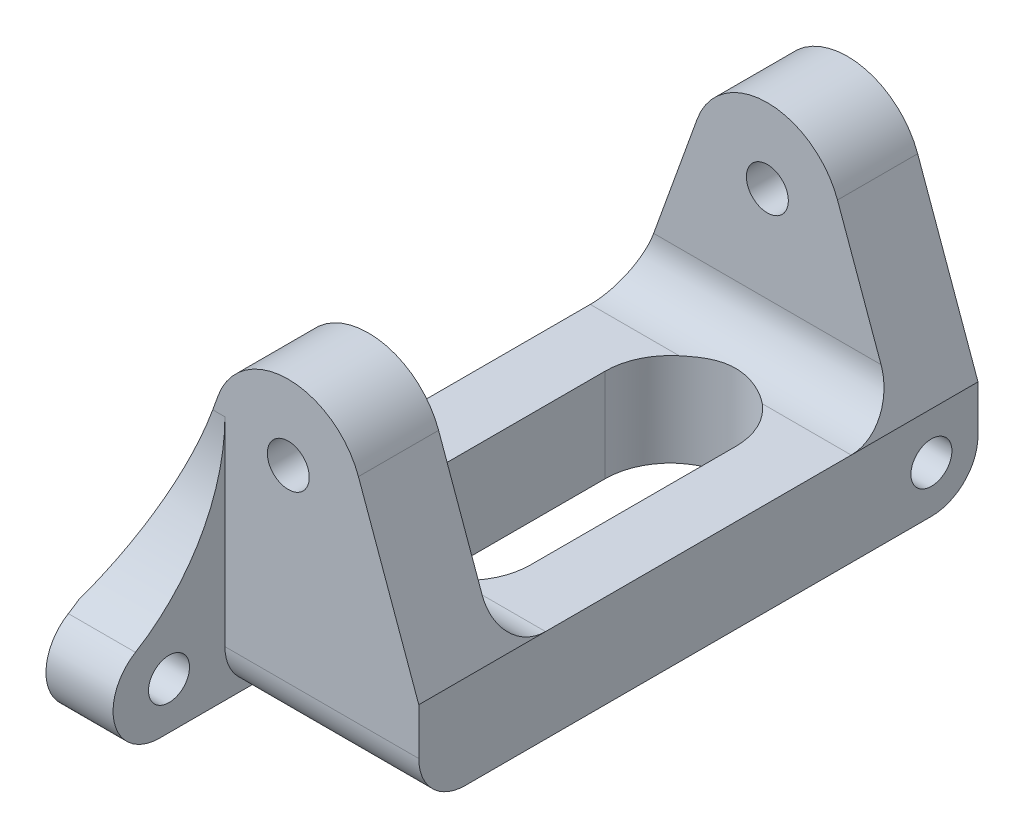
ISO-10303-21;
HEADER;
FILE_DESCRIPTION(('STEP AP214'),'2;1');
FILE_NAME('part.step','',(''),(''),'','','');
FILE_SCHEMA(('AUTOMOTIVE_DESIGN { 1 0 10303 214 1 1 1 1 }'));
ENDSEC;
DATA;
#1=APPLICATION_CONTEXT('core data for automotive mechanical design processes');
#2=APPLICATION_PROTOCOL_DEFINITION('international standard','automotive_design',2000,#1);
#3=PRODUCT_CONTEXT('',#1,'mechanical');
#4=PRODUCT('Part','Part','',(#3));
#5=PRODUCT_RELATED_PRODUCT_CATEGORY('part','',(#4));
#6=PRODUCT_DEFINITION_FORMATION('','',#4);
#7=PRODUCT_DEFINITION_CONTEXT('part definition',#1,'design');
#8=PRODUCT_DEFINITION('design','',#6,#7);
#9=PRODUCT_DEFINITION_SHAPE('','',#8);
#10=(LENGTH_UNIT() NAMED_UNIT(*) SI_UNIT(.MILLI.,.METRE.));
#11=(NAMED_UNIT(*) PLANE_ANGLE_UNIT() SI_UNIT($,.RADIAN.));
#12=(NAMED_UNIT(*) SI_UNIT($,.STERADIAN.) SOLID_ANGLE_UNIT());
#13=UNCERTAINTY_MEASURE_WITH_UNIT(LENGTH_MEASURE(1.E-05),#10,'distance_accuracy_value','');
#14=(GEOMETRIC_REPRESENTATION_CONTEXT(3) GLOBAL_UNCERTAINTY_ASSIGNED_CONTEXT((#13)) GLOBAL_UNIT_ASSIGNED_CONTEXT((#10,
#11,#12)) REPRESENTATION_CONTEXT('',''));
#15=CARTESIAN_POINT('',(0.,0.,0.));
#16=DIRECTION('',(0.,0.,1.));
#17=DIRECTION('',(1.,0.,0.));
#18=AXIS2_PLACEMENT_3D('',#15,#16,#17);
#19=CARTESIAN_POINT('',(0.,0.,0.));
#20=DIRECTION('',(0.,1.,0.));
#21=DIRECTION('',(0.,0.,1.));
#22=AXIS2_PLACEMENT_3D('',#19,#20,#21);
#23=PLANE('',#22);
#24=DIRECTION('',(0.,0.,1.));
#25=VECTOR('',#24,1.);
#26=CARTESIAN_POINT('',(-3.5,0.,5.5));
#27=LINE('',#26,#25);
#28=CARTESIAN_POINT('',(-3.5,0.,-5.5));
#29=VERTEX_POINT('',#28);
#30=CARTESIAN_POINT('',(-3.5,0.,5.5));
#31=VERTEX_POINT('',#30);
#32=EDGE_CURVE('E556',#29,#31,#27,.T.);
#33=ORIENTED_EDGE('',*,*,#32,.F.);
#34=CARTESIAN_POINT('',(0.,0.,-5.5));
#35=DIRECTION('',(0.,1.,0.));
#36=DIRECTION('',(0.,0.,1.));
#37=AXIS2_PLACEMENT_3D('',#34,#35,#36);
#38=CIRCLE('',#37,3.5);
#39=CARTESIAN_POINT('',(-2.22710574513201,0.,-8.2));
#40=VERTEX_POINT('',#39);
#41=EDGE_CURVE('E555',#40,#29,#38,.T.);
#42=ORIENTED_EDGE('',*,*,#41,.F.);
#43=DIRECTION('',(-1.,0.,0.));
#44=VECTOR('',#43,1.);
#45=CARTESIAN_POINT('',(-7.,0.,-8.2));
#46=LINE('',#45,#44);
#47=CARTESIAN_POINT('',(-7.,0.,-8.19999999999998));
#48=VERTEX_POINT('',#47);
#49=EDGE_CURVE('E440',#40,#48,#46,.T.);
#50=ORIENTED_EDGE('',*,*,#49,.T.);
#51=DIRECTION('',(0.,0.,-1.));
#52=VECTOR('',#51,1.);
#53=CARTESIAN_POINT('',(-7.,0.,0.));
#54=LINE('',#53,#52);
#55=CARTESIAN_POINT('',(-7.,0.,8.19999999999998));
#56=VERTEX_POINT('',#55);
#57=EDGE_CURVE('E429',#56,#48,#54,.T.);
#58=ORIENTED_EDGE('',*,*,#57,.F.);
#59=DIRECTION('',(-1.,0.,0.));
#60=VECTOR('',#59,1.);
#61=CARTESIAN_POINT('',(-7.,0.,8.2));
#62=LINE('',#61,#60);
#63=CARTESIAN_POINT('',(-2.22710574513201,0.,8.2));
#64=VERTEX_POINT('',#63);
#65=EDGE_CURVE('E354',#64,#56,#62,.T.);
#66=ORIENTED_EDGE('',*,*,#65,.F.);
#67=CARTESIAN_POINT('',(0.,0.,5.5));
#68=DIRECTION('',(0.,-1.,0.));
#69=DIRECTION('',(0.,0.,-1.));
#70=AXIS2_PLACEMENT_3D('',#67,#68,#69);
#71=CIRCLE('',#70,3.5);
#72=EDGE_CURVE('E226',#64,#31,#71,.T.);
#73=ORIENTED_EDGE('',*,*,#72,.T.);
#74=EDGE_LOOP('',(#33,#42,#50,#58,#66,#73));
#75=FACE_BOUND('',#74,.T.);
#76=ADVANCED_FACE('F32',(#75),#23,.T.);
#77=CARTESIAN_POINT('',(3.5,0.,-5.5));
#78=VERTEX_POINT('',#77);
#79=CARTESIAN_POINT('',(2.22710574513201,0.,-8.2));
#80=VERTEX_POINT('',#79);
#81=EDGE_CURVE('E495',#78,#80,#38,.T.);
#82=ORIENTED_EDGE('',*,*,#81,.F.);
#83=DIRECTION('',(0.,0.,-1.));
#84=VECTOR('',#83,1.);
#85=CARTESIAN_POINT('',(3.5,0.,5.5));
#86=LINE('',#85,#84);
#87=CARTESIAN_POINT('',(3.5,0.,5.5));
#88=VERTEX_POINT('',#87);
#89=EDGE_CURVE('E380',#88,#78,#86,.T.);
#90=ORIENTED_EDGE('',*,*,#89,.F.);
#91=CARTESIAN_POINT('',(2.22710574513201,0.,8.2));
#92=VERTEX_POINT('',#91);
#93=EDGE_CURVE('E587',#88,#92,#71,.T.);
#94=ORIENTED_EDGE('',*,*,#93,.T.);
#95=CARTESIAN_POINT('',(7.,0.,8.2));
#96=VERTEX_POINT('',#95);
#97=EDGE_CURVE('E355',#96,#92,#62,.T.);
#98=ORIENTED_EDGE('',*,*,#97,.F.);
#99=DIRECTION('',(0.,0.,-1.));
#100=VECTOR('',#99,1.);
#101=CARTESIAN_POINT('',(7.,0.,0.));
#102=LINE('',#101,#100);
#103=CARTESIAN_POINT('',(7.,0.,-8.2));
#104=VERTEX_POINT('',#103);
#105=EDGE_CURVE('E426',#96,#104,#102,.T.);
#106=ORIENTED_EDGE('',*,*,#105,.T.);
#107=EDGE_CURVE('E442',#104,#80,#46,.T.);
#108=ORIENTED_EDGE('',*,*,#107,.T.);
#109=EDGE_LOOP('',(#82,#90,#94,#98,#106,#108));
#110=FACE_BOUND('',#109,.T.);
#111=ADVANCED_FACE('F251',(#110),#23,.T.);
#112=CARTESIAN_POINT('',(-7.,-5.,0.));
#113=DIRECTION('',(1.,0.,0.));
#114=DIRECTION('',(0.,0.,-1.));
#115=AXIS2_PLACEMENT_3D('',#112,#113,#114);
#116=PLANE('',#115);
#117=CARTESIAN_POINT('',(-7.,-2.5,-12.5));
#118=DIRECTION('',(-1.,0.,0.));
#119=DIRECTION('',(0.,0.,1.));
#120=AXIS2_PLACEMENT_3D('',#117,#118,#119);
#121=CIRCLE('',#120,1.1);
#122=CARTESIAN_POINT('',(-7.,-2.5,-11.4));
#123=VERTEX_POINT('',#122);
#124=EDGE_CURVE('E422',#123,#123,#121,.T.);
#125=ORIENTED_EDGE('',*,*,#124,.F.);
#126=EDGE_LOOP('',(#125));
#127=FACE_BOUND('',#126,.T.);
#128=DIRECTION('',(0.,0.,-1.));
#129=VECTOR('',#128,1.);
#130=CARTESIAN_POINT('',(-7.,-5.,0.));
#131=LINE('',#130,#129);
#132=CARTESIAN_POINT('',(-6.99999999999999,-5.,18.5));
#133=VERTEX_POINT('',#132);
#134=CARTESIAN_POINT('',(-7.,-5.,-12.5));
#135=VERTEX_POINT('',#134);
#136=EDGE_CURVE('E197',#133,#135,#131,.T.);
#137=ORIENTED_EDGE('',*,*,#136,.F.);
#138=CARTESIAN_POINT('',(-6.99999999999999,-2.5,18.5));
#139=DIRECTION('',(1.,0.,0.));
#140=DIRECTION('',(0.,0.,-1.));
#141=AXIS2_PLACEMENT_3D('',#138,#139,#140);
#142=CIRCLE('',#141,2.5);
#143=CARTESIAN_POINT('',(-6.99999999999999,-0.364584349593738,19.8));
#144=VERTEX_POINT('',#143);
#145=EDGE_CURVE('E186',#144,#133,#142,.T.);
#146=ORIENTED_EDGE('',*,*,#145,.F.);
#147=CARTESIAN_POINT('',(-7.,8.17707825203131,25.));
#148=DIRECTION('',(1.,0.,0.));
#149=DIRECTION('',(0.,0.,-1.));
#150=AXIS2_PLACEMENT_3D('',#147,#148,#149);
#151=CIRCLE('',#150,10.);
#152=CARTESIAN_POINT('',(-7.,0.,19.243665119179));
#153=VERTEX_POINT('',#152);
#154=EDGE_CURVE('E40',#144,#153,#151,.T.);
#155=ORIENTED_EDGE('',*,*,#154,.T.);
#156=DIRECTION('',(0.,0.,1.));
#157=VECTOR('',#156,1.);
#158=CARTESIAN_POINT('',(-7.,0.,-7.49726971278934));
#159=LINE('',#158,#157);
#160=EDGE_CURVE('E46',#56,#153,#159,.T.);
#161=ORIENTED_EDGE('',*,*,#160,.F.);
#162=ORIENTED_EDGE('',*,*,#57,.T.);
#163=DIRECTION('',(0.,0.,-1.));
#164=VECTOR('',#163,1.);
#165=CARTESIAN_POINT('',(-7.,0.,7.49726971278934));
#166=LINE('',#165,#164);
#167=CARTESIAN_POINT('',(-7.,0.,-15.));
#168=VERTEX_POINT('',#167);
#169=EDGE_CURVE('E431',#48,#168,#166,.T.);
#170=ORIENTED_EDGE('',*,*,#169,.T.);
#171=DIRECTION('',(0.,1.,0.));
#172=VECTOR('',#171,1.);
#173=CARTESIAN_POINT('',(-7.,-5.,-15.));
#174=LINE('',#173,#172);
#175=CARTESIAN_POINT('',(-7.,-2.5,-15.));
#176=VERTEX_POINT('',#175);
#177=EDGE_CURVE('E438',#176,#168,#174,.T.);
#178=ORIENTED_EDGE('',*,*,#177,.F.);
#179=CARTESIAN_POINT('',(-7.,-2.5,-12.5));
#180=DIRECTION('',(1.,0.,0.));
#181=DIRECTION('',(0.,0.,-1.));
#182=AXIS2_PLACEMENT_3D('',#179,#180,#181);
#183=CIRCLE('',#182,2.5);
#184=EDGE_CURVE('E202',#176,#135,#183,.F.);
#185=ORIENTED_EDGE('',*,*,#184,.T.);
#186=EDGE_LOOP('',(#137,#146,#155,#161,#162,#170,#178,#185));
#187=FACE_BOUND('',#186,.T.);
#188=CARTESIAN_POINT('',(-6.99999999999999,-2.5,18.));
#189=DIRECTION('',(1.,0.,0.));
#190=DIRECTION('',(0.,0.,-1.));
#191=AXIS2_PLACEMENT_3D('',#188,#189,#190);
#192=CIRCLE('',#191,1.1);
#193=CARTESIAN_POINT('',(-6.99999999999999,-2.5,16.9));
#194=VERTEX_POINT('',#193);
#195=EDGE_CURVE('E511',#194,#194,#192,.T.);
#196=ORIENTED_EDGE('',*,*,#195,.T.);
#197=EDGE_LOOP('',(#196));
#198=FACE_BOUND('',#197,.T.);
#199=ADVANCED_FACE('F198',(#127,#187,#198),#116,.F.);
#200=CARTESIAN_POINT('',(0.,-5.,-15.));
#201=DIRECTION('',(0.,0.,1.));
#202=DIRECTION('',(1.,0.,0.));
#203=AXIS2_PLACEMENT_3D('',#200,#201,#202);
#204=PLANE('',#203);
#205=CARTESIAN_POINT('',(0.,7.625,-15.));
#206=DIRECTION('',(0.,0.,-1.));
#207=DIRECTION('',(-1.,0.,0.));
#208=AXIS2_PLACEMENT_3D('',#205,#206,#207);
#209=CIRCLE('',#208,1.125);
#210=CARTESIAN_POINT('',(-1.125,7.625,-15.));
#211=VERTEX_POINT('',#210);
#212=EDGE_CURVE('E568',#211,#211,#209,.T.);
#213=ORIENTED_EDGE('',*,*,#212,.F.);
#214=EDGE_LOOP('',(#213));
#215=FACE_BOUND('',#214,.T.);
#216=DIRECTION('',(0.,1.,0.));
#217=VECTOR('',#216,1.);
#218=CARTESIAN_POINT('',(7.,-5.,-15.));
#219=LINE('',#218,#217);
#220=CARTESIAN_POINT('',(7.,-2.5,-15.));
#221=VERTEX_POINT('',#220);
#222=CARTESIAN_POINT('',(7.,0.,-15.));
#223=VERTEX_POINT('',#222);
#224=EDGE_CURVE('E206',#221,#223,#219,.T.);
#225=ORIENTED_EDGE('',*,*,#224,.F.);
#226=DIRECTION('',(1.,0.,0.));
#227=VECTOR('',#226,1.);
#228=CARTESIAN_POINT('',(0.,-2.5,-15.));
#229=LINE('',#228,#227);
#230=EDGE_CURVE('E288',#221,#176,#229,.F.);
#231=ORIENTED_EDGE('',*,*,#230,.T.);
#232=ORIENTED_EDGE('',*,*,#177,.T.);
#233=DIRECTION('',(0.339062045334858,0.940764013668328,0.));
#234=VECTOR('',#233,1.);
#235=CARTESIAN_POINT('',(-7.,0.,-15.));
#236=LINE('',#235,#234);
#237=CARTESIAN_POINT('',(-3.76305605467331,8.98124818133944,-15.));
#238=VERTEX_POINT('',#237);
#239=EDGE_CURVE('E465',#168,#238,#236,.T.);
#240=ORIENTED_EDGE('',*,*,#239,.T.);
#241=CARTESIAN_POINT('',(0.,7.625,-15.));
#242=DIRECTION('',(0.,0.,-1.));
#243=DIRECTION('',(-1.,0.,0.));
#244=AXIS2_PLACEMENT_3D('',#241,#242,#243);
#245=CIRCLE('',#244,4.);
#246=CARTESIAN_POINT('',(3.76305605467331,8.98124818133944,-15.));
#247=VERTEX_POINT('',#246);
#248=EDGE_CURVE('E459',#238,#247,#245,.T.);
#249=ORIENTED_EDGE('',*,*,#248,.T.);
#250=DIRECTION('',(0.339062045334859,-0.940764013668328,0.));
#251=VECTOR('',#250,1.);
#252=CARTESIAN_POINT('',(7.,0.,-15.));
#253=LINE('',#252,#251);
#254=EDGE_CURVE('E456',#247,#223,#253,.T.);
#255=ORIENTED_EDGE('',*,*,#254,.T.);
#256=EDGE_LOOP('',(#225,#231,#232,#240,#249,#255));
#257=FACE_BOUND('',#256,.T.);
#258=ADVANCED_FACE('F264',(#215,#257),#204,.F.);
#259=CARTESIAN_POINT('',(7.,-5.,0.));
#260=DIRECTION('',(1.,0.,0.));
#261=DIRECTION('',(0.,0.,-1.));
#262=AXIS2_PLACEMENT_3D('',#259,#260,#261);
#263=PLANE('',#262);
#264=CARTESIAN_POINT('',(7.,-2.5,-12.5));
#265=DIRECTION('',(1.,0.,0.));
#266=DIRECTION('',(0.,0.,-1.));
#267=AXIS2_PLACEMENT_3D('',#264,#265,#266);
#268=CIRCLE('',#267,1.1);
#269=CARTESIAN_POINT('',(7.,-2.5,-13.6));
#270=VERTEX_POINT('',#269);
#271=EDGE_CURVE('E425',#270,#270,#268,.F.);
#272=ORIENTED_EDGE('',*,*,#271,.T.);
#273=EDGE_LOOP('',(#272));
#274=FACE_BOUND('',#273,.T.);
#275=DIRECTION('',(0.,0.,-1.));
#276=VECTOR('',#275,1.);
#277=CARTESIAN_POINT('',(7.,-5.,0.));
#278=LINE('',#277,#276);
#279=CARTESIAN_POINT('',(7.,-5.,12.5));
#280=VERTEX_POINT('',#279);
#281=CARTESIAN_POINT('',(7.,-5.,-12.5));
#282=VERTEX_POINT('',#281);
#283=EDGE_CURVE('E207',#280,#282,#278,.T.);
#284=ORIENTED_EDGE('',*,*,#283,.T.);
#285=CARTESIAN_POINT('',(7.,-2.5,-12.5));
#286=DIRECTION('',(1.,0.,0.));
#287=DIRECTION('',(0.,0.,-1.));
#288=AXIS2_PLACEMENT_3D('',#285,#286,#287);
#289=CIRCLE('',#288,2.5);
#290=EDGE_CURVE('E294',#282,#221,#289,.T.);
#291=ORIENTED_EDGE('',*,*,#290,.T.);
#292=ORIENTED_EDGE('',*,*,#224,.T.);
#293=DIRECTION('',(0.,0.,-1.));
#294=VECTOR('',#293,1.);
#295=CARTESIAN_POINT('',(7.,0.,7.49726971278934));
#296=LINE('',#295,#294);
#297=EDGE_CURVE('E475',#104,#223,#296,.T.);
#298=ORIENTED_EDGE('',*,*,#297,.F.);
#299=ORIENTED_EDGE('',*,*,#105,.F.);
#300=DIRECTION('',(0.,0.,1.));
#301=VECTOR('',#300,1.);
#302=CARTESIAN_POINT('',(7.,0.,-7.49726971278934));
#303=LINE('',#302,#301);
#304=CARTESIAN_POINT('',(7.,0.,15.));
#305=VERTEX_POINT('',#304);
#306=EDGE_CURVE('E342',#96,#305,#303,.T.);
#307=ORIENTED_EDGE('',*,*,#306,.T.);
#308=DIRECTION('',(0.,1.,0.));
#309=VECTOR('',#308,1.);
#310=CARTESIAN_POINT('',(7.,-5.,15.));
#311=LINE('',#310,#309);
#312=CARTESIAN_POINT('',(7.,-2.5,15.));
#313=VERTEX_POINT('',#312);
#314=EDGE_CURVE('E351',#313,#305,#311,.T.);
#315=ORIENTED_EDGE('',*,*,#314,.F.);
#316=CARTESIAN_POINT('',(7.,-2.5,12.5));
#317=DIRECTION('',(-1.,0.,0.));
#318=DIRECTION('',(0.,0.,1.));
#319=AXIS2_PLACEMENT_3D('',#316,#317,#318);
#320=CIRCLE('',#319,2.5);
#321=EDGE_CURVE('E363',#280,#313,#320,.T.);
#322=ORIENTED_EDGE('',*,*,#321,.F.);
#323=EDGE_LOOP('',(#284,#291,#292,#298,#299,#307,#315,#322));
#324=FACE_BOUND('',#323,.T.);
#325=ADVANCED_FACE('F268',(#274,#324),#263,.T.);
#326=CARTESIAN_POINT('',(0.,-5.,0.));
#327=DIRECTION('',(0.,1.,0.));
#328=DIRECTION('',(0.,0.,1.));
#329=AXIS2_PLACEMENT_3D('',#326,#327,#328);
#330=PLANE('',#329);
#331=DIRECTION('',(0.,0.,1.));
#332=VECTOR('',#331,1.);
#333=CARTESIAN_POINT('',(-3.5,-5.,0.));
#334=LINE('',#333,#332);
#335=CARTESIAN_POINT('',(-3.5,-5.,-5.5));
#336=VERTEX_POINT('',#335);
#337=CARTESIAN_POINT('',(-3.5,-5.,5.5));
#338=VERTEX_POINT('',#337);
#339=EDGE_CURVE('E300',#336,#338,#334,.T.);
#340=ORIENTED_EDGE('',*,*,#339,.T.);
#341=CARTESIAN_POINT('',(0.,-5.,5.5));
#342=DIRECTION('',(0.,-1.,0.));
#343=DIRECTION('',(0.,0.,-1.));
#344=AXIS2_PLACEMENT_3D('',#341,#342,#343);
#345=CIRCLE('',#344,3.5);
#346=CARTESIAN_POINT('',(3.5,-5.,5.5));
#347=VERTEX_POINT('',#346);
#348=EDGE_CURVE('E227',#338,#347,#345,.F.);
#349=ORIENTED_EDGE('',*,*,#348,.T.);
#350=DIRECTION('',(0.,0.,1.));
#351=VECTOR('',#350,1.);
#352=CARTESIAN_POINT('',(3.5,-5.,5.5));
#353=LINE('',#352,#351);
#354=CARTESIAN_POINT('',(3.5,-5.,-5.5));
#355=VERTEX_POINT('',#354);
#356=EDGE_CURVE('E567',#355,#347,#353,.T.);
#357=ORIENTED_EDGE('',*,*,#356,.F.);
#358=CARTESIAN_POINT('',(0.,-5.,-5.5));
#359=DIRECTION('',(0.,1.,0.));
#360=DIRECTION('',(0.,0.,1.));
#361=AXIS2_PLACEMENT_3D('',#358,#359,#360);
#362=CIRCLE('',#361,3.5);
#363=EDGE_CURVE('E381',#336,#355,#362,.F.);
#364=ORIENTED_EDGE('',*,*,#363,.F.);
#365=EDGE_LOOP('',(#340,#349,#357,#364));
#366=FACE_BOUND('',#365,.T.);
#367=DIRECTION('',(1.,0.,0.));
#368=VECTOR('',#367,1.);
#369=CARTESIAN_POINT('',(0.,-5.,12.5));
#370=LINE('',#369,#368);
#371=CARTESIAN_POINT('',(-3.4,-5.,12.5));
#372=VERTEX_POINT('',#371);
#373=EDGE_CURVE('E361',#372,#280,#370,.T.);
#374=ORIENTED_EDGE('',*,*,#373,.F.);
#375=DIRECTION('',(0.,0.,-1.));
#376=VECTOR('',#375,1.);
#377=CARTESIAN_POINT('',(-3.4,-5.,12.5));
#378=LINE('',#377,#376);
#379=CARTESIAN_POINT('',(-3.4,-5.,18.5));
#380=VERTEX_POINT('',#379);
#381=EDGE_CURVE('E194',#380,#372,#378,.T.);
#382=ORIENTED_EDGE('',*,*,#381,.F.);
#383=DIRECTION('',(1.,0.,0.));
#384=VECTOR('',#383,1.);
#385=CARTESIAN_POINT('',(-6.99999999999999,-5.,18.5));
#386=LINE('',#385,#384);
#387=EDGE_CURVE('E190',#133,#380,#386,.T.);
#388=ORIENTED_EDGE('',*,*,#387,.F.);
#389=ORIENTED_EDGE('',*,*,#136,.T.);
#390=DIRECTION('',(1.,0.,0.));
#391=VECTOR('',#390,1.);
#392=CARTESIAN_POINT('',(0.,-5.,-12.5));
#393=LINE('',#392,#391);
#394=EDGE_CURVE('E289',#135,#282,#393,.T.);
#395=ORIENTED_EDGE('',*,*,#394,.T.);
#396=ORIENTED_EDGE('',*,*,#283,.F.);
#397=EDGE_LOOP('',(#374,#382,#388,#389,#395,#396));
#398=FACE_BOUND('',#397,.T.);
#399=ADVANCED_FACE('F210',(#366,#398),#330,.F.);
#400=CARTESIAN_POINT('',(10.1112698372208,-2.5,-12.5));
#401=DIRECTION('',(-1.,0.,0.));
#402=DIRECTION('',(0.,0.,1.));
#403=AXIS2_PLACEMENT_3D('',#400,#401,#402);
#404=CYLINDRICAL_SURFACE('',#403,1.1);
#405=ORIENTED_EDGE('',*,*,#124,.T.);
#406=EDGE_LOOP('',(#405));
#407=FACE_BOUND('',#406,.T.);
#408=ORIENTED_EDGE('',*,*,#271,.F.);
#409=EDGE_LOOP('',(#408));
#410=FACE_BOUND('',#409,.T.);
#411=ADVANCED_FACE('F411',(#407,#410),#404,.F.);
#412=CARTESIAN_POINT('',(0.,0.,-10.7));
#413=DIRECTION('',(0.,0.,1.));
#414=DIRECTION('',(1.,0.,0.));
#415=AXIS2_PLACEMENT_3D('',#412,#413,#414);
#416=PLANE('',#415);
#417=CARTESIAN_POINT('',(0.,7.625,-10.7));
#418=DIRECTION('',(0.,0.,1.));
#419=DIRECTION('',(1.,0.,0.));
#420=AXIS2_PLACEMENT_3D('',#417,#418,#419);
#421=CIRCLE('',#420,1.125);
#422=CARTESIAN_POINT('',(1.125,7.625,-10.7));
#423=VERTEX_POINT('',#422);
#424=EDGE_CURVE('E468',#423,#423,#421,.F.);
#425=ORIENTED_EDGE('',*,*,#424,.T.);
#426=EDGE_LOOP('',(#425));
#427=FACE_BOUND('',#426,.T.);
#428=DIRECTION('',(0.339062045334858,0.940764013668328,0.));
#429=VECTOR('',#428,1.);
#430=CARTESIAN_POINT('',(-7.,0.,-10.7));
#431=LINE('',#430,#429);
#432=CARTESIAN_POINT('',(-6.09897157945925,2.5,-10.7));
#433=VERTEX_POINT('',#432);
#434=CARTESIAN_POINT('',(-3.76305605467331,8.98124818133944,-10.7));
#435=VERTEX_POINT('',#434);
#436=EDGE_CURVE('E461',#433,#435,#431,.T.);
#437=ORIENTED_EDGE('',*,*,#436,.F.);
#438=DIRECTION('',(-1.,0.,0.));
#439=VECTOR('',#438,1.);
#440=CARTESIAN_POINT('',(7.,2.5,-10.7));
#441=LINE('',#440,#439);
#442=CARTESIAN_POINT('',(6.09897157945926,2.5,-10.7));
#443=VERTEX_POINT('',#442);
#444=EDGE_CURVE('E445',#433,#443,#441,.F.);
#445=ORIENTED_EDGE('',*,*,#444,.T.);
#446=DIRECTION('',(0.339062045334859,-0.940764013668328,0.));
#447=VECTOR('',#446,1.);
#448=CARTESIAN_POINT('',(7.,0.,-10.7));
#449=LINE('',#448,#447);
#450=CARTESIAN_POINT('',(3.76305605467331,8.98124818133944,-10.7));
#451=VERTEX_POINT('',#450);
#452=EDGE_CURVE('E472',#451,#443,#449,.T.);
#453=ORIENTED_EDGE('',*,*,#452,.F.);
#454=CARTESIAN_POINT('',(0.,7.625,-10.7));
#455=DIRECTION('',(0.,0.,1.));
#456=DIRECTION('',(1.,0.,0.));
#457=AXIS2_PLACEMENT_3D('',#454,#455,#456);
#458=CIRCLE('',#457,4.);
#459=EDGE_CURVE('E477',#435,#451,#458,.F.);
#460=ORIENTED_EDGE('',*,*,#459,.F.);
#461=EDGE_LOOP('',(#437,#445,#453,#460));
#462=FACE_BOUND('',#461,.T.);
#463=ADVANCED_FACE('F408',(#427,#462),#416,.T.);
#464=CARTESIAN_POINT('',(-7.,0.,7.49726971278934));
#465=DIRECTION('',(-0.940764013668328,0.339062045334858,0.));
#466=DIRECTION('',(-0.339062045334858,-0.940764013668328,0.));
#467=AXIS2_PLACEMENT_3D('',#464,#465,#466);
#468=PLANE('',#467);
#469=ORIENTED_EDGE('',*,*,#169,.F.);
#470=CARTESIAN_POINT('',(-6.09897157945925,2.5,-8.2));
#471=DIRECTION('',(-0.940764013668328,0.339062045334858,0.));
#472=DIRECTION('',(0.339062045334858,0.940764013668328,0.));
#473=AXIS2_PLACEMENT_3D('',#470,#471,#472);
#474=ELLIPSE('',#473,2.6574145733442,2.5);
#475=EDGE_CURVE('E290',#48,#433,#474,.F.);
#476=ORIENTED_EDGE('',*,*,#475,.T.);
#477=ORIENTED_EDGE('',*,*,#436,.T.);
#478=DIRECTION('',(0.,0.,-1.));
#479=VECTOR('',#478,1.);
#480=CARTESIAN_POINT('',(-3.76305605467331,8.98124818133944,7.49726971278934));
#481=LINE('',#480,#479);
#482=EDGE_CURVE('E463',#435,#238,#481,.T.);
#483=ORIENTED_EDGE('',*,*,#482,.T.);
#484=ORIENTED_EDGE('',*,*,#239,.F.);
#485=EDGE_LOOP('',(#469,#476,#477,#483,#484));
#486=FACE_BOUND('',#485,.T.);
#487=ADVANCED_FACE('F404',(#486),#468,.T.);
#488=CARTESIAN_POINT('',(0.,7.625,7.49726971278934));
#489=DIRECTION('',(0.,0.,-1.));
#490=DIRECTION('',(-1.,0.,0.));
#491=AXIS2_PLACEMENT_3D('',#488,#489,#490);
#492=CYLINDRICAL_SURFACE('',#491,4.);
#493=ORIENTED_EDGE('',*,*,#482,.F.);
#494=ORIENTED_EDGE('',*,*,#459,.T.);
#495=DIRECTION('',(0.,0.,-1.));
#496=VECTOR('',#495,1.);
#497=CARTESIAN_POINT('',(3.76305605467331,8.98124818133944,7.49726971278934));
#498=LINE('',#497,#496);
#499=EDGE_CURVE('E476',#451,#247,#498,.T.);
#500=ORIENTED_EDGE('',*,*,#499,.T.);
#501=ORIENTED_EDGE('',*,*,#248,.F.);
#502=EDGE_LOOP('',(#493,#494,#500,#501));
#503=FACE_BOUND('',#502,.T.);
#504=ADVANCED_FACE('F400',(#503),#492,.T.);
#505=CARTESIAN_POINT('',(7.,0.,7.49726971278934));
#506=DIRECTION('',(0.940764013668328,0.339062045334859,0.));
#507=DIRECTION('',(-0.339062045334859,0.940764013668328,0.));
#508=AXIS2_PLACEMENT_3D('',#505,#506,#507);
#509=PLANE('',#508);
#510=ORIENTED_EDGE('',*,*,#499,.F.);
#511=ORIENTED_EDGE('',*,*,#452,.T.);
#512=CARTESIAN_POINT('',(6.09897157945926,2.5,-8.2));
#513=DIRECTION('',(0.940764013668328,0.339062045334859,0.));
#514=DIRECTION('',(0.339062045334859,-0.940764013668328,0.));
#515=AXIS2_PLACEMENT_3D('',#512,#513,#514);
#516=ELLIPSE('',#515,2.6574145733442,2.5);
#517=EDGE_CURVE('E292',#443,#104,#516,.F.);
#518=ORIENTED_EDGE('',*,*,#517,.T.);
#519=ORIENTED_EDGE('',*,*,#297,.T.);
#520=ORIENTED_EDGE('',*,*,#254,.F.);
#521=EDGE_LOOP('',(#510,#511,#518,#519,#520));
#522=FACE_BOUND('',#521,.T.);
#523=ADVANCED_FACE('F396',(#522),#509,.T.);
#524=CARTESIAN_POINT('',(0.,7.625,-7.51801948466054));
#525=DIRECTION('',(0.,0.,-1.));
#526=DIRECTION('',(-1.,0.,0.));
#527=AXIS2_PLACEMENT_3D('',#524,#525,#526);
#528=CYLINDRICAL_SURFACE('',#527,1.125);
#529=ORIENTED_EDGE('',*,*,#212,.T.);
#530=EDGE_LOOP('',(#529));
#531=FACE_BOUND('',#530,.T.);
#532=ORIENTED_EDGE('',*,*,#424,.F.);
#533=EDGE_LOOP('',(#532));
#534=FACE_BOUND('',#533,.T.);
#535=ADVANCED_FACE('F276',(#531,#534),#528,.F.);
#536=CARTESIAN_POINT('',(0.,2.5,-8.2));
#537=DIRECTION('',(1.,0.,0.));
#538=DIRECTION('',(0.,0.,-1.));
#539=AXIS2_PLACEMENT_3D('',#536,#537,#538);
#540=CYLINDRICAL_SURFACE('',#539,2.5);
#541=ORIENTED_EDGE('',*,*,#49,.F.);
#542=CARTESIAN_POINT('',(-2.22710574513203,0.,-8.19999999999998));
#543=CARTESIAN_POINT('',(-2.14472873409994,2.17248012795122E-05,-8.26796951492385));
#544=CARTESIAN_POINT('',(-2.05928060457079,0.00277114986269859,-8.33209606816453));
#545=CARTESIAN_POINT('',(-1.88308781622532,0.0120167440778355,-8.4521697699696));
#546=CARTESIAN_POINT('',(-1.79234705635556,0.0185101856758199,-8.50812283585367));
#547=CARTESIAN_POINT('',(-1.60620722442231,0.0335470444907468,-8.61150369140827));
#548=CARTESIAN_POINT('',(-1.51080395531602,0.042092336834342,-8.65892361313589));
#549=CARTESIAN_POINT('',(-1.31610651331225,0.0597041483468459,-8.74487035621686));
#550=CARTESIAN_POINT('',(-1.21681204668044,0.0687707068887321,-8.78339650468862));
#551=CARTESIAN_POINT('',(-1.02536061507345,0.0851828721368716,-8.84780091174308));
#552=CARTESIAN_POINT('',(-0.933508697764408,0.0926096873258149,-8.87456843386554));
#553=CARTESIAN_POINT('',(-0.747820876159442,0.105958446407206,-8.92051293903721));
#554=CARTESIAN_POINT('',(-0.653985171307719,0.111880540807858,-8.93969068135368));
#555=CARTESIAN_POINT('',(-0.465151387521365,0.121566846462805,-8.97026832052391));
#556=CARTESIAN_POINT('',(-0.370156278177597,0.125335719738407,-8.98168503134565));
#557=CARTESIAN_POINT('',(-0.179479524175504,0.130331765988633,-8.99670306940935));
#558=CARTESIAN_POINT('',(-0.0837978696703044,0.131558902434612,-9.0003042843307));
#559=CARTESIAN_POINT('',(0.107434369522413,0.131339906349205,-8.99965581026899));
#560=CARTESIAN_POINT('',(0.20298498583364,0.12989659872414,-8.99541441752406));
#561=CARTESIAN_POINT('',(0.393344301934386,0.124496755198824,-8.97913871371953));
#562=CARTESIAN_POINT('',(0.488153011211726,0.120540251491732,-8.96710450248316));
#563=CARTESIAN_POINT('',(0.6765604881326,0.110526398969544,-8.93531844225375));
#564=CARTESIAN_POINT('',(0.770156235078786,0.104464576030045,-8.91555014574215));
#565=CARTESIAN_POINT('',(0.955321722473723,0.090899146409633,-8.86845500007253));
#566=CARTESIAN_POINT('',(1.04689127616429,0.0833954074367205,-8.84112745727238));
#567=CARTESIAN_POINT('',(1.23605783000467,0.0670407083369384,-8.77613979515736));
#568=CARTESIAN_POINT('',(1.33339728136705,0.0581295100074885,-8.73774302837563));
#569=CARTESIAN_POINT('',(1.52428250607473,0.0408851465726569,-8.65237952380868));
#570=CARTESIAN_POINT('',(1.61782864364416,0.0325519259165145,-8.60541361120341));
#571=CARTESIAN_POINT('',(1.80037970534706,0.0179242052890914,-8.50325659748575));
#572=CARTESIAN_POINT('',(1.88938919145012,0.011627621824126,-8.44807398707306));
#573=CARTESIAN_POINT('',(2.0622918519879,0.00267425509937264,-8.32983367745119));
#574=CARTESIAN_POINT('',(2.14618123987968,2.01351719946812E-05,-8.2667702525907));
#575=CARTESIAN_POINT('',(2.22710574513203,0.,-8.19999999999999));
#576=B_SPLINE_CURVE_WITH_KNOTS('',3,(#542,#543,#544,#545,#546,#547,#548,#549,#550,#551,#552,
#553,#554,#555,#556,#557,#558,#559,#560,#561,#562,#563,#564,#565,#566,#567,#568,#569,#570,#571,
#572,#573,#574,#575),.UNSPECIFIED.,.F.,.F.,(4,2,2,2,2,2,2,2,2,2,2,2,2,2,2,2,4),(0.,
0.320141208402113,0.640049484691488,0.960251236050945,1.28047720517466,1.56803980313178,
1.8555736265925,2.1424825170179,2.42939553073428,2.71600520949574,3.00261121696207,
3.2898300709925,3.57707528918919,3.89170305762746,4.20630054444402,4.52057517044836,
4.83507946866049),.UNSPECIFIED.);
#577=EDGE_CURVE('E372',#40,#80,#576,.T.);
#578=ORIENTED_EDGE('',*,*,#577,.T.);
#579=ORIENTED_EDGE('',*,*,#107,.F.);
#580=ORIENTED_EDGE('',*,*,#517,.F.);
#581=ORIENTED_EDGE('',*,*,#444,.F.);
#582=ORIENTED_EDGE('',*,*,#475,.F.);
#583=EDGE_LOOP('',(#541,#578,#579,#580,#581,#582));
#584=FACE_BOUND('',#583,.T.);
#585=ADVANCED_FACE('F273',(#584),#540,.F.);
#586=CARTESIAN_POINT('',(0.,-2.5,-12.5));
#587=DIRECTION('',(1.,0.,0.));
#588=DIRECTION('',(0.,0.,-1.));
#589=AXIS2_PLACEMENT_3D('',#586,#587,#588);
#590=CYLINDRICAL_SURFACE('',#589,2.5);
#591=ORIENTED_EDGE('',*,*,#184,.F.);
#592=ORIENTED_EDGE('',*,*,#230,.F.);
#593=ORIENTED_EDGE('',*,*,#290,.F.);
#594=ORIENTED_EDGE('',*,*,#394,.F.);
#595=EDGE_LOOP('',(#591,#592,#593,#594));
#596=FACE_BOUND('',#595,.T.);
#597=ADVANCED_FACE('F275',(#596),#590,.T.);
#598=CARTESIAN_POINT('',(-3.5,-24.313207915828,5.5));
#599=DIRECTION('',(-1.,0.,0.));
#600=DIRECTION('',(0.,0.,1.));
#601=AXIS2_PLACEMENT_3D('',#598,#599,#600);
#602=PLANE('',#601);
#603=ORIENTED_EDGE('',*,*,#32,.T.);
#604=DIRECTION('',(0.,1.,0.));
#605=VECTOR('',#604,1.);
#606=CARTESIAN_POINT('',(-3.5,-24.313207915828,5.5));
#607=LINE('',#606,#605);
#608=EDGE_CURVE('E583',#338,#31,#607,.T.);
#609=ORIENTED_EDGE('',*,*,#608,.F.);
#610=ORIENTED_EDGE('',*,*,#339,.F.);
#611=DIRECTION('',(0.,1.,0.));
#612=VECTOR('',#611,1.);
#613=CARTESIAN_POINT('',(-3.5,-24.313207915828,-5.5));
#614=LINE('',#613,#612);
#615=EDGE_CURVE('E563',#336,#29,#614,.T.);
#616=ORIENTED_EDGE('',*,*,#615,.T.);
#617=EDGE_LOOP('',(#603,#609,#610,#616));
#618=FACE_BOUND('',#617,.T.);
#619=ADVANCED_FACE('F279',(#618),#602,.F.);
#620=CARTESIAN_POINT('',(0.,-24.313207915828,-5.5));
#621=DIRECTION('',(0.,1.,0.));
#622=DIRECTION('',(0.,0.,1.));
#623=AXIS2_PLACEMENT_3D('',#620,#621,#622);
#624=CYLINDRICAL_SURFACE('',#623,3.5);
#625=ORIENTED_EDGE('',*,*,#363,.T.);
#626=DIRECTION('',(0.,1.,0.));
#627=VECTOR('',#626,1.);
#628=CARTESIAN_POINT('',(3.5,-24.313207915828,-5.5));
#629=LINE('',#628,#627);
#630=EDGE_CURVE('E562',#355,#78,#629,.T.);
#631=ORIENTED_EDGE('',*,*,#630,.T.);
#632=ORIENTED_EDGE('',*,*,#81,.T.);
#633=ORIENTED_EDGE('',*,*,#577,.F.);
#634=ORIENTED_EDGE('',*,*,#41,.T.);
#635=ORIENTED_EDGE('',*,*,#615,.F.);
#636=EDGE_LOOP('',(#625,#631,#632,#633,#634,#635));
#637=FACE_BOUND('',#636,.T.);
#638=ADVANCED_FACE('F284',(#637),#624,.F.);
#639=CARTESIAN_POINT('',(3.5,-24.313207915828,5.5));
#640=DIRECTION('',(1.,0.,0.));
#641=DIRECTION('',(0.,0.,-1.));
#642=AXIS2_PLACEMENT_3D('',#639,#640,#641);
#643=PLANE('',#642);
#644=ORIENTED_EDGE('',*,*,#356,.T.);
#645=DIRECTION('',(0.,1.,0.));
#646=VECTOR('',#645,1.);
#647=CARTESIAN_POINT('',(3.5,-24.313207915828,5.5));
#648=LINE('',#647,#646);
#649=EDGE_CURVE('E585',#347,#88,#648,.T.);
#650=ORIENTED_EDGE('',*,*,#649,.T.);
#651=ORIENTED_EDGE('',*,*,#89,.T.);
#652=ORIENTED_EDGE('',*,*,#630,.F.);
#653=EDGE_LOOP('',(#644,#650,#651,#652));
#654=FACE_BOUND('',#653,.T.);
#655=ADVANCED_FACE('F389',(#654),#643,.F.);
#656=CARTESIAN_POINT('',(0.,-5.,15.));
#657=DIRECTION('',(0.,0.,-1.));
#658=DIRECTION('',(1.,0.,0.));
#659=AXIS2_PLACEMENT_3D('',#656,#657,#658);
#660=PLANE('',#659);
#661=CARTESIAN_POINT('',(0.,7.625,15.));
#662=DIRECTION('',(0.,0.,-1.));
#663=DIRECTION('',(-1.,0.,0.));
#664=AXIS2_PLACEMENT_3D('',#661,#662,#663);
#665=CIRCLE('',#664,1.125);
#666=CARTESIAN_POINT('',(-1.125,7.625,15.));
#667=VERTEX_POINT('',#666);
#668=EDGE_CURVE('E331',#667,#667,#665,.T.);
#669=ORIENTED_EDGE('',*,*,#668,.T.);
#670=EDGE_LOOP('',(#669));
#671=FACE_BOUND('',#670,.T.);
#672=DIRECTION('',(0.339062045334858,0.940764013668328,0.));
#673=VECTOR('',#672,1.);
#674=CARTESIAN_POINT('',(-7.,0.,15.));
#675=LINE('',#674,#673);
#676=CARTESIAN_POINT('',(-4.05288803917366,8.17707825203131,15.));
#677=VERTEX_POINT('',#676);
#678=CARTESIAN_POINT('',(-3.76305605467331,8.98124818133944,15.));
#679=VERTEX_POINT('',#678);
#680=EDGE_CURVE('E318',#677,#679,#675,.T.);
#681=ORIENTED_EDGE('',*,*,#680,.F.);
#682=DIRECTION('',(1.,0.,0.));
#683=VECTOR('',#682,1.);
#684=CARTESIAN_POINT('',(0.,8.17707825203131,15.));
#685=LINE('',#684,#683);
#686=CARTESIAN_POINT('',(-3.4,8.17707825203131,15.));
#687=VERTEX_POINT('',#686);
#688=EDGE_CURVE('E305',#677,#687,#685,.T.);
#689=ORIENTED_EDGE('',*,*,#688,.T.);
#690=DIRECTION('',(0.,-1.,0.));
#691=VECTOR('',#690,1.);
#692=CARTESIAN_POINT('',(-3.4,-5.,15.));
#693=LINE('',#692,#691);
#694=CARTESIAN_POINT('',(-3.4,-2.5,15.));
#695=VERTEX_POINT('',#694);
#696=EDGE_CURVE('E212',#687,#695,#693,.T.);
#697=ORIENTED_EDGE('',*,*,#696,.T.);
#698=DIRECTION('',(1.,0.,0.));
#699=VECTOR('',#698,1.);
#700=CARTESIAN_POINT('',(0.,-2.5,15.));
#701=LINE('',#700,#699);
#702=EDGE_CURVE('E365',#313,#695,#701,.F.);
#703=ORIENTED_EDGE('',*,*,#702,.F.);
#704=ORIENTED_EDGE('',*,*,#314,.T.);
#705=DIRECTION('',(0.339062045334859,-0.940764013668328,0.));
#706=VECTOR('',#705,1.);
#707=CARTESIAN_POINT('',(7.,0.,15.));
#708=LINE('',#707,#706);
#709=CARTESIAN_POINT('',(3.76305605467331,8.98124818133944,15.));
#710=VERTEX_POINT('',#709);
#711=EDGE_CURVE('E328',#710,#305,#708,.T.);
#712=ORIENTED_EDGE('',*,*,#711,.F.);
#713=CARTESIAN_POINT('',(0.,7.625,15.));
#714=DIRECTION('',(0.,0.,-1.));
#715=DIRECTION('',(-1.,0.,0.));
#716=AXIS2_PLACEMENT_3D('',#713,#714,#715);
#717=CIRCLE('',#716,4.);
#718=EDGE_CURVE('E325',#679,#710,#717,.T.);
#719=ORIENTED_EDGE('',*,*,#718,.F.);
#720=EDGE_LOOP('',(#681,#689,#697,#703,#704,#712,#719));
#721=FACE_BOUND('',#720,.T.);
#722=ADVANCED_FACE('F322',(#671,#721),#660,.F.);
#723=CARTESIAN_POINT('',(0.,0.,10.7));
#724=DIRECTION('',(0.,0.,-1.));
#725=DIRECTION('',(1.,0.,0.));
#726=AXIS2_PLACEMENT_3D('',#723,#724,#725);
#727=PLANE('',#726);
#728=CARTESIAN_POINT('',(0.,7.625,10.7));
#729=DIRECTION('',(0.,0.,1.));
#730=DIRECTION('',(1.,0.,0.));
#731=AXIS2_PLACEMENT_3D('',#728,#729,#730);
#732=CIRCLE('',#731,1.125);
#733=CARTESIAN_POINT('',(1.125,7.625,10.7));
#734=VERTEX_POINT('',#733);
#735=EDGE_CURVE('E326',#734,#734,#732,.F.);
#736=ORIENTED_EDGE('',*,*,#735,.F.);
#737=EDGE_LOOP('',(#736));
#738=FACE_BOUND('',#737,.T.);
#739=DIRECTION('',(0.339062045334858,0.940764013668328,0.));
#740=VECTOR('',#739,1.);
#741=CARTESIAN_POINT('',(-7.,0.,10.7));
#742=LINE('',#741,#740);
#743=CARTESIAN_POINT('',(-6.09897157945925,2.5,10.7));
#744=VERTEX_POINT('',#743);
#745=CARTESIAN_POINT('',(-3.76305605467331,8.98124818133944,10.7));
#746=VERTEX_POINT('',#745);
#747=EDGE_CURVE('E335',#744,#746,#742,.T.);
#748=ORIENTED_EDGE('',*,*,#747,.T.);
#749=CARTESIAN_POINT('',(0.,7.625,10.7));
#750=DIRECTION('',(0.,0.,1.));
#751=DIRECTION('',(1.,0.,0.));
#752=AXIS2_PLACEMENT_3D('',#749,#750,#751);
#753=CIRCLE('',#752,4.);
#754=CARTESIAN_POINT('',(3.76305605467331,8.98124818133944,10.7));
#755=VERTEX_POINT('',#754);
#756=EDGE_CURVE('E344',#746,#755,#753,.F.);
#757=ORIENTED_EDGE('',*,*,#756,.T.);
#758=DIRECTION('',(0.339062045334859,-0.940764013668328,0.));
#759=VECTOR('',#758,1.);
#760=CARTESIAN_POINT('',(7.,0.,10.7));
#761=LINE('',#760,#759);
#762=CARTESIAN_POINT('',(6.09897157945926,2.5,10.7));
#763=VERTEX_POINT('',#762);
#764=EDGE_CURVE('E339',#755,#763,#761,.T.);
#765=ORIENTED_EDGE('',*,*,#764,.T.);
#766=DIRECTION('',(-1.,0.,0.));
#767=VECTOR('',#766,1.);
#768=CARTESIAN_POINT('',(7.,2.5,10.7));
#769=LINE('',#768,#767);
#770=EDGE_CURVE('E358',#744,#763,#769,.F.);
#771=ORIENTED_EDGE('',*,*,#770,.F.);
#772=EDGE_LOOP('',(#748,#757,#765,#771));
#773=FACE_BOUND('',#772,.T.);
#774=ADVANCED_FACE('F527',(#738,#773),#727,.T.);
#775=CARTESIAN_POINT('',(-7.,0.,-7.49726971278934));
#776=DIRECTION('',(-0.940764013668328,0.339062045334858,0.));
#777=DIRECTION('',(-0.339062045334858,-0.940764013668328,0.));
#778=AXIS2_PLACEMENT_3D('',#775,#776,#777);
#779=PLANE('',#778);
#780=ORIENTED_EDGE('',*,*,#160,.T.);
#781=CARTESIAN_POINT('',(-4.05288803917366,8.17707825203131,25.));
#782=DIRECTION('',(-0.940764013668328,0.339062045334858,0.));
#783=DIRECTION('',(0.339062045334858,0.940764013668328,0.));
#784=AXIS2_PLACEMENT_3D('',#781,#782,#783);
#785=ELLIPSE('',#784,10.6296582933768,10.);
#786=EDGE_CURVE('E11',#153,#677,#785,.F.);
#787=ORIENTED_EDGE('',*,*,#786,.T.);
#788=ORIENTED_EDGE('',*,*,#680,.T.);
#789=DIRECTION('',(0.,0.,1.));
#790=VECTOR('',#789,1.);
#791=CARTESIAN_POINT('',(-3.76305605467331,8.98124818133944,-7.49726971278934));
#792=LINE('',#791,#790);
#793=EDGE_CURVE('E338',#746,#679,#792,.T.);
#794=ORIENTED_EDGE('',*,*,#793,.F.);
#795=ORIENTED_EDGE('',*,*,#747,.F.);
#796=CARTESIAN_POINT('',(-6.09897157945925,2.5,8.2));
#797=DIRECTION('',(0.940764013668328,-0.339062045334858,0.));
#798=DIRECTION('',(0.339062045334858,0.940764013668328,0.));
#799=AXIS2_PLACEMENT_3D('',#796,#797,#798);
#800=ELLIPSE('',#799,2.6574145733442,2.5);
#801=EDGE_CURVE('E367',#56,#744,#800,.F.);
#802=ORIENTED_EDGE('',*,*,#801,.F.);
#803=EDGE_LOOP('',(#780,#787,#788,#794,#795,#802));
#804=FACE_BOUND('',#803,.T.);
#805=ADVANCED_FACE('F317',(#804),#779,.T.);
#806=CARTESIAN_POINT('',(0.,7.625,-7.49726971278934));
#807=DIRECTION('',(0.,0.,1.));
#808=DIRECTION('',(-1.,0.,0.));
#809=AXIS2_PLACEMENT_3D('',#806,#807,#808);
#810=CYLINDRICAL_SURFACE('',#809,4.);
#811=ORIENTED_EDGE('',*,*,#793,.T.);
#812=ORIENTED_EDGE('',*,*,#718,.T.);
#813=DIRECTION('',(0.,0.,1.));
#814=VECTOR('',#813,1.);
#815=CARTESIAN_POINT('',(3.76305605467331,8.98124818133944,-7.49726971278934));
#816=LINE('',#815,#814);
#817=EDGE_CURVE('E343',#755,#710,#816,.T.);
#818=ORIENTED_EDGE('',*,*,#817,.F.);
#819=ORIENTED_EDGE('',*,*,#756,.F.);
#820=EDGE_LOOP('',(#811,#812,#818,#819));
#821=FACE_BOUND('',#820,.T.);
#822=ADVANCED_FACE('F534',(#821),#810,.T.);
#823=CARTESIAN_POINT('',(7.,0.,-7.49726971278934));
#824=DIRECTION('',(0.940764013668328,0.339062045334859,0.));
#825=DIRECTION('',(-0.339062045334859,0.940764013668328,0.));
#826=AXIS2_PLACEMENT_3D('',#823,#824,#825);
#827=PLANE('',#826);
#828=ORIENTED_EDGE('',*,*,#817,.T.);
#829=ORIENTED_EDGE('',*,*,#711,.T.);
#830=ORIENTED_EDGE('',*,*,#306,.F.);
#831=CARTESIAN_POINT('',(6.09897157945926,2.5,8.2));
#832=DIRECTION('',(-0.940764013668328,-0.339062045334859,0.));
#833=DIRECTION('',(0.339062045334859,-0.940764013668328,0.));
#834=AXIS2_PLACEMENT_3D('',#831,#832,#833);
#835=ELLIPSE('',#834,2.6574145733442,2.5);
#836=EDGE_CURVE('E369',#763,#96,#835,.F.);
#837=ORIENTED_EDGE('',*,*,#836,.F.);
#838=ORIENTED_EDGE('',*,*,#764,.F.);
#839=EDGE_LOOP('',(#828,#829,#830,#837,#838));
#840=FACE_BOUND('',#839,.T.);
#841=ADVANCED_FACE('F506',(#840),#827,.T.);
#842=CARTESIAN_POINT('',(0.,7.625,7.51801948466054));
#843=DIRECTION('',(0.,0.,1.));
#844=DIRECTION('',(-1.,0.,0.));
#845=AXIS2_PLACEMENT_3D('',#842,#843,#844);
#846=CYLINDRICAL_SURFACE('',#845,1.125);
#847=ORIENTED_EDGE('',*,*,#668,.F.);
#848=EDGE_LOOP('',(#847));
#849=FACE_BOUND('',#848,.T.);
#850=ORIENTED_EDGE('',*,*,#735,.T.);
#851=EDGE_LOOP('',(#850));
#852=FACE_BOUND('',#851,.T.);
#853=ADVANCED_FACE('F522',(#849,#852),#846,.F.);
#854=CARTESIAN_POINT('',(0.,2.5,8.2));
#855=DIRECTION('',(1.,0.,0.));
#856=DIRECTION('',(0.,0.,1.));
#857=AXIS2_PLACEMENT_3D('',#854,#855,#856);
#858=CYLINDRICAL_SURFACE('',#857,2.5);
#859=ORIENTED_EDGE('',*,*,#65,.T.);
#860=ORIENTED_EDGE('',*,*,#801,.T.);
#861=ORIENTED_EDGE('',*,*,#770,.T.);
#862=ORIENTED_EDGE('',*,*,#836,.T.);
#863=ORIENTED_EDGE('',*,*,#97,.T.);
#864=CARTESIAN_POINT('',(-2.22710574513203,0.,8.19999999999998));
#865=CARTESIAN_POINT('',(-2.14472873409994,2.17248012795122E-05,8.26796951492385));
#866=CARTESIAN_POINT('',(-2.05928060457079,0.00277114986269859,8.33209606816453));
#867=CARTESIAN_POINT('',(-1.88308781622532,0.0120167440778355,8.4521697699696));
#868=CARTESIAN_POINT('',(-1.79234705635556,0.0185101856758199,8.50812283585367));
#869=CARTESIAN_POINT('',(-1.60620722442231,0.0335470444907468,8.61150369140827));
#870=CARTESIAN_POINT('',(-1.51080395531602,0.042092336834342,8.65892361313589));
#871=CARTESIAN_POINT('',(-1.31610651331225,0.0597041483468459,8.74487035621686));
#872=CARTESIAN_POINT('',(-1.21681204668044,0.0687707068887321,8.78339650468862));
#873=CARTESIAN_POINT('',(-1.02536061507345,0.0851828721368716,8.84780091174308));
#874=CARTESIAN_POINT('',(-0.933508697764408,0.0926096873258149,8.87456843386554));
#875=CARTESIAN_POINT('',(-0.747820876159442,0.105958446407206,8.92051293903721));
#876=CARTESIAN_POINT('',(-0.653985171307719,0.111880540807858,8.93969068135368));
#877=CARTESIAN_POINT('',(-0.465151387521365,0.121566846462805,8.97026832052391));
#878=CARTESIAN_POINT('',(-0.370156278177597,0.125335719738407,8.98168503134565));
#879=CARTESIAN_POINT('',(-0.179479524175504,0.130331765988633,8.99670306940935));
#880=CARTESIAN_POINT('',(-0.0837978696703044,0.131558902434612,9.0003042843307));
#881=CARTESIAN_POINT('',(0.107434369522413,0.131339906349205,8.99965581026899));
#882=CARTESIAN_POINT('',(0.20298498583364,0.12989659872414,8.99541441752406));
#883=CARTESIAN_POINT('',(0.393344301934386,0.124496755198824,8.97913871371953));
#884=CARTESIAN_POINT('',(0.488153011211726,0.120540251491732,8.96710450248316));
#885=CARTESIAN_POINT('',(0.6765604881326,0.110526398969544,8.93531844225375));
#886=CARTESIAN_POINT('',(0.770156235078786,0.104464576030045,8.91555014574215));
#887=CARTESIAN_POINT('',(0.955321722473723,0.090899146409633,8.86845500007253));
#888=CARTESIAN_POINT('',(1.04689127616429,0.0833954074367205,8.84112745727238));
#889=CARTESIAN_POINT('',(1.23605783000467,0.0670407083369384,8.77613979515736));
#890=CARTESIAN_POINT('',(1.33339728136705,0.0581295100074885,8.73774302837563));
#891=CARTESIAN_POINT('',(1.52428250607473,0.0408851465726569,8.65237952380868));
#892=CARTESIAN_POINT('',(1.61782864364416,0.0325519259165145,8.60541361120341));
#893=CARTESIAN_POINT('',(1.80037970534706,0.0179242052890914,8.50325659748575));
#894=CARTESIAN_POINT('',(1.88938919145012,0.011627621824126,8.44807398707306));
#895=CARTESIAN_POINT('',(2.0622918519879,0.00267425509937264,8.32983367745119));
#896=CARTESIAN_POINT('',(2.14618123987968,2.01351719946812E-05,8.2667702525907));
#897=CARTESIAN_POINT('',(2.22710574513203,0.,8.19999999999999));
#898=B_SPLINE_CURVE_WITH_KNOTS('',3,(#864,#865,#866,#867,#868,#869,#870,#871,#872,#873,#874,
#875,#876,#877,#878,#879,#880,#881,#882,#883,#884,#885,#886,#887,#888,#889,#890,#891,#892,#893,
#894,#895,#896,#897),.UNSPECIFIED.,.F.,.F.,(4,2,2,2,2,2,2,2,2,2,2,2,2,2,2,2,4),(0.,
0.320141208402113,0.640049484691488,0.960251236050945,1.28047720517466,1.56803980313178,
1.8555736265925,2.1424825170179,2.42939553073428,2.71600520949574,3.00261121696207,
3.2898300709925,3.57707528918919,3.89170305762746,4.20630054444402,4.52057517044836,
4.83507946866049),.UNSPECIFIED.);
#899=EDGE_CURVE('E215',#64,#92,#898,.T.);
#900=ORIENTED_EDGE('',*,*,#899,.F.);
#901=EDGE_LOOP('',(#859,#860,#861,#862,#863,#900));
#902=FACE_BOUND('',#901,.T.);
#903=ADVANCED_FACE('F502',(#902),#858,.F.);
#904=CARTESIAN_POINT('',(0.,-2.5,12.5));
#905=DIRECTION('',(1.,0.,0.));
#906=DIRECTION('',(0.,0.,1.));
#907=AXIS2_PLACEMENT_3D('',#904,#905,#906);
#908=CYLINDRICAL_SURFACE('',#907,2.5);
#909=CARTESIAN_POINT('',(-3.4,-2.5,12.5));
#910=DIRECTION('',(1.,0.,0.));
#911=DIRECTION('',(0.,0.,-1.));
#912=AXIS2_PLACEMENT_3D('',#909,#910,#911);
#913=CIRCLE('',#912,2.5);
#914=EDGE_CURVE('E302',#372,#695,#913,.F.);
#915=ORIENTED_EDGE('',*,*,#914,.F.);
#916=ORIENTED_EDGE('',*,*,#373,.T.);
#917=ORIENTED_EDGE('',*,*,#321,.T.);
#918=ORIENTED_EDGE('',*,*,#702,.T.);
#919=EDGE_LOOP('',(#915,#916,#917,#918));
#920=FACE_BOUND('',#919,.T.);
#921=ADVANCED_FACE('F246',(#920),#908,.T.);
#922=CARTESIAN_POINT('',(0.,-24.313207915828,5.5));
#923=DIRECTION('',(0.,1.,0.));
#924=DIRECTION('',(0.,0.,-1.));
#925=AXIS2_PLACEMENT_3D('',#922,#923,#924);
#926=CYLINDRICAL_SURFACE('',#925,3.5);
#927=ORIENTED_EDGE('',*,*,#348,.F.);
#928=ORIENTED_EDGE('',*,*,#608,.T.);
#929=ORIENTED_EDGE('',*,*,#72,.F.);
#930=ORIENTED_EDGE('',*,*,#899,.T.);
#931=ORIENTED_EDGE('',*,*,#93,.F.);
#932=ORIENTED_EDGE('',*,*,#649,.F.);
#933=EDGE_LOOP('',(#927,#928,#929,#930,#931,#932));
#934=FACE_BOUND('',#933,.T.);
#935=ADVANCED_FACE('F241',(#934),#926,.F.);
#936=CARTESIAN_POINT('',(-6.99999999999999,-2.5,18.));
#937=DIRECTION('',(1.,0.,0.));
#938=DIRECTION('',(0.,0.,-1.));
#939=AXIS2_PLACEMENT_3D('',#936,#937,#938);
#940=CYLINDRICAL_SURFACE('',#939,1.1);
#941=ORIENTED_EDGE('',*,*,#195,.F.);
#942=EDGE_LOOP('',(#941));
#943=FACE_BOUND('',#942,.T.);
#944=CARTESIAN_POINT('',(-3.4,-2.5,18.));
#945=DIRECTION('',(1.,0.,0.));
#946=DIRECTION('',(0.,0.,-1.));
#947=AXIS2_PLACEMENT_3D('',#944,#945,#946);
#948=CIRCLE('',#947,1.1);
#949=CARTESIAN_POINT('',(-3.4,-2.5,16.9));
#950=VERTEX_POINT('',#949);
#951=EDGE_CURVE('E513',#950,#950,#948,.T.);
#952=ORIENTED_EDGE('',*,*,#951,.T.);
#953=EDGE_LOOP('',(#952));
#954=FACE_BOUND('',#953,.T.);
#955=ADVANCED_FACE('F236',(#943,#954),#940,.F.);
#956=CARTESIAN_POINT('',(-6.99999999999999,-2.5,18.5));
#957=DIRECTION('',(1.,0.,0.));
#958=DIRECTION('',(0.,0.,-1.));
#959=AXIS2_PLACEMENT_3D('',#956,#957,#958);
#960=CYLINDRICAL_SURFACE('',#959,2.5);
#961=CARTESIAN_POINT('',(-3.4,-2.5,18.5));
#962=DIRECTION('',(1.,0.,0.));
#963=DIRECTION('',(0.,0.,-1.));
#964=AXIS2_PLACEMENT_3D('',#961,#962,#963);
#965=CIRCLE('',#964,2.5);
#966=CARTESIAN_POINT('',(-3.4,-0.364584349593738,19.8));
#967=VERTEX_POINT('',#966);
#968=EDGE_CURVE('E510',#967,#380,#965,.T.);
#969=ORIENTED_EDGE('',*,*,#968,.F.);
#970=DIRECTION('',(1.,0.,0.));
#971=VECTOR('',#970,1.);
#972=CARTESIAN_POINT('',(-6.99999999999999,-0.364584349593738,19.8));
#973=LINE('',#972,#971);
#974=EDGE_CURVE('E54',#967,#144,#973,.F.);
#975=ORIENTED_EDGE('',*,*,#974,.T.);
#976=ORIENTED_EDGE('',*,*,#145,.T.);
#977=ORIENTED_EDGE('',*,*,#387,.T.);
#978=EDGE_LOOP('',(#969,#975,#976,#977));
#979=FACE_BOUND('',#978,.T.);
#980=ADVANCED_FACE('F188',(#979),#960,.T.);
#981=CARTESIAN_POINT('',(-3.4,-2.5,12.5));
#982=DIRECTION('',(1.,0.,0.));
#983=DIRECTION('',(0.,0.,-1.));
#984=AXIS2_PLACEMENT_3D('',#981,#982,#983);
#985=PLANE('',#984);
#986=ORIENTED_EDGE('',*,*,#951,.F.);
#987=EDGE_LOOP('',(#986));
#988=FACE_BOUND('',#987,.T.);
#989=ORIENTED_EDGE('',*,*,#696,.F.);
#990=CARTESIAN_POINT('',(-3.4,8.17707825203131,25.));
#991=DIRECTION('',(1.,0.,0.));
#992=DIRECTION('',(0.,0.,-1.));
#993=AXIS2_PLACEMENT_3D('',#990,#991,#992);
#994=CIRCLE('',#993,10.);
#995=EDGE_CURVE('E309',#687,#967,#994,.F.);
#996=ORIENTED_EDGE('',*,*,#995,.T.);
#997=ORIENTED_EDGE('',*,*,#968,.T.);
#998=ORIENTED_EDGE('',*,*,#381,.T.);
#999=ORIENTED_EDGE('',*,*,#914,.T.);
#1000=EDGE_LOOP('',(#989,#996,#997,#998,#999));
#1001=FACE_BOUND('',#1000,.T.);
#1002=ADVANCED_FACE('F235',(#988,#1001),#985,.T.);
#1003=CARTESIAN_POINT('',(-6.99999999999999,8.17707825203131,25.));
#1004=DIRECTION('',(1.,0.,0.));
#1005=DIRECTION('',(0.,0.,-1.));
#1006=AXIS2_PLACEMENT_3D('',#1003,#1004,#1005);
#1007=CYLINDRICAL_SURFACE('',#1006,10.);
#1008=ORIENTED_EDGE('',*,*,#154,.F.);
#1009=ORIENTED_EDGE('',*,*,#974,.F.);
#1010=ORIENTED_EDGE('',*,*,#995,.F.);
#1011=ORIENTED_EDGE('',*,*,#688,.F.);
#1012=ORIENTED_EDGE('',*,*,#786,.F.);
#1013=EDGE_LOOP('',(#1008,#1009,#1010,#1011,#1012));
#1014=FACE_BOUND('',#1013,.T.);
#1015=ADVANCED_FACE('F34',(#1014),#1007,.F.);
#1016=CLOSED_SHELL('',(#76,#111,#199,#258,#325,#399,#411,#463,#487,#504,#523,#535,#585,#597,
#619,#638,#655,#722,#774,#805,#822,#841,#853,#903,#921,#935,#955,#980,#1002,#1015));
#1017=MANIFOLD_SOLID_BREP('B2',#1016);
#1018=ADVANCED_BREP_SHAPE_REPRESENTATION('',(#18,#1017),#14);
#1019=SHAPE_DEFINITION_REPRESENTATION(#9,#1018);
ENDSEC;
END-ISO-10303-21;
